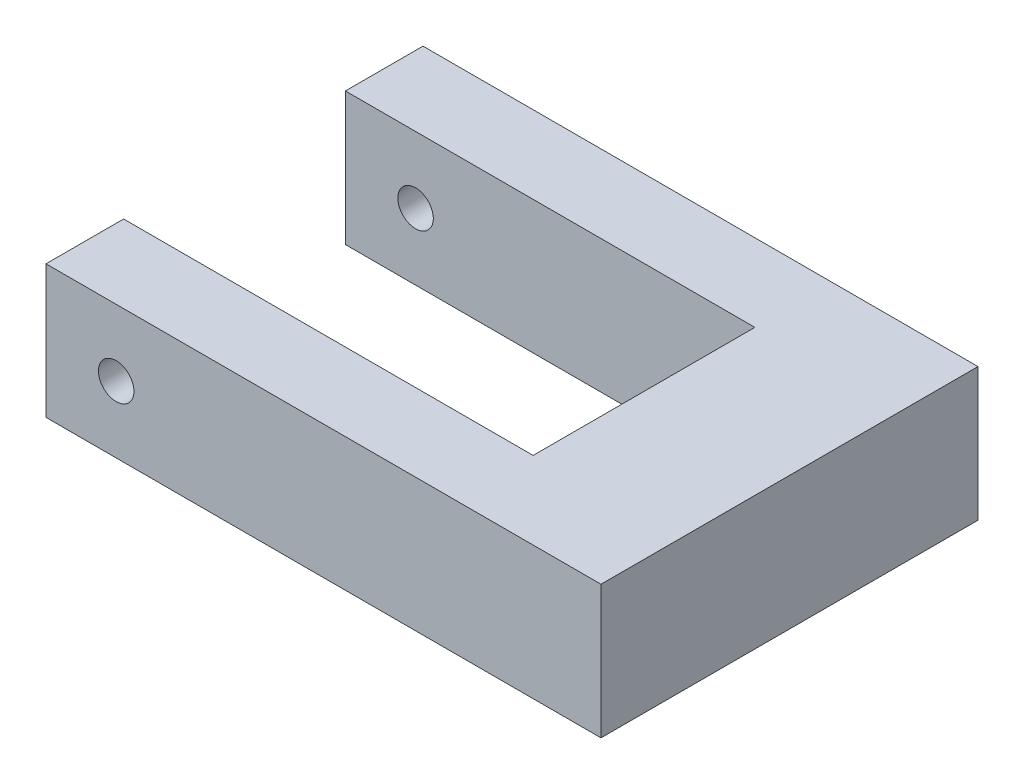
ISO-10303-21;
HEADER;
FILE_DESCRIPTION(('STEP AP214'),'2;1');
FILE_NAME('part.step','',(''),(''),'','','');
FILE_SCHEMA(('AUTOMOTIVE_DESIGN { 1 0 10303 214 1 1 1 1 }'));
ENDSEC;
DATA;
#1=APPLICATION_CONTEXT('core data for automotive mechanical design processes');
#2=APPLICATION_PROTOCOL_DEFINITION('international standard','automotive_design',2000,#1);
#3=PRODUCT_CONTEXT('',#1,'mechanical');
#4=PRODUCT('Part','Part','',(#3));
#5=PRODUCT_RELATED_PRODUCT_CATEGORY('part','',(#4));
#6=PRODUCT_DEFINITION_FORMATION('','',#4);
#7=PRODUCT_DEFINITION_CONTEXT('part definition',#1,'design');
#8=PRODUCT_DEFINITION('design','',#6,#7);
#9=PRODUCT_DEFINITION_SHAPE('','',#8);
#10=(LENGTH_UNIT() NAMED_UNIT(*) SI_UNIT(.MILLI.,.METRE.));
#11=(NAMED_UNIT(*) PLANE_ANGLE_UNIT() SI_UNIT($,.RADIAN.));
#12=(NAMED_UNIT(*) SI_UNIT($,.STERADIAN.) SOLID_ANGLE_UNIT());
#13=UNCERTAINTY_MEASURE_WITH_UNIT(LENGTH_MEASURE(1.E-05),#10,'distance_accuracy_value','');
#14=(GEOMETRIC_REPRESENTATION_CONTEXT(3) GLOBAL_UNCERTAINTY_ASSIGNED_CONTEXT((#13)) GLOBAL_UNIT_ASSIGNED_CONTEXT((#10,
#11,#12)) REPRESENTATION_CONTEXT('',''));
#15=CARTESIAN_POINT('',(0.,0.,0.));
#16=DIRECTION('',(0.,0.,1.));
#17=DIRECTION('',(1.,0.,0.));
#18=AXIS2_PLACEMENT_3D('',#15,#16,#17);
#19=CARTESIAN_POINT('',(0.,5.9580992385565,-77.5));
#20=DIRECTION('',(-1.,0.,0.));
#21=DIRECTION('',(0.,-1.,0.));
#22=AXIS2_PLACEMENT_3D('',#19,#20,#21);
#23=PLANE('',#22);
#24=DIRECTION('',(0.,-1.,0.));
#25=VECTOR('',#24,1.);
#26=CARTESIAN_POINT('',(0.,5.9580992385565,-60.));
#27=LINE('',#26,#25);
#28=CARTESIAN_POINT('',(0.,5.9580992385565,-60.));
#29=VERTEX_POINT('',#28);
#30=CARTESIAN_POINT('',(0.,-24.0419007614435,-60.));
#31=VERTEX_POINT('',#30);
#32=EDGE_CURVE('E42',#29,#31,#27,.T.);
#33=ORIENTED_EDGE('',*,*,#32,.F.);
#34=DIRECTION('',(0.,0.,1.));
#35=VECTOR('',#34,1.);
#36=CARTESIAN_POINT('',(0.,5.9580992385565,-77.5));
#37=LINE('',#36,#35);
#38=CARTESIAN_POINT('',(0.,5.9580992385565,-77.5));
#39=VERTEX_POINT('',#38);
#40=EDGE_CURVE('E85',#39,#29,#37,.T.);
#41=ORIENTED_EDGE('',*,*,#40,.F.);
#42=DIRECTION('',(0.,-1.,0.));
#43=VECTOR('',#42,1.);
#44=CARTESIAN_POINT('',(0.,5.9580992385565,-77.5));
#45=LINE('',#44,#43);
#46=CARTESIAN_POINT('',(0.,-24.0419007614435,-77.5));
#47=VERTEX_POINT('',#46);
#48=EDGE_CURVE('E139',#39,#47,#45,.T.);
#49=ORIENTED_EDGE('',*,*,#48,.T.);
#50=DIRECTION('',(0.,0.,1.));
#51=VECTOR('',#50,1.);
#52=CARTESIAN_POINT('',(0.,-24.0419007614435,-77.5));
#53=LINE('',#52,#51);
#54=EDGE_CURVE('E162',#47,#31,#53,.T.);
#55=ORIENTED_EDGE('',*,*,#54,.T.);
#56=EDGE_LOOP('',(#33,#41,#49,#55));
#57=FACE_BOUND('',#56,.T.);
#58=ADVANCED_FACE('F33',(#57),#23,.T.);
#59=CARTESIAN_POINT('',(0.,5.9580992385565,-77.5));
#60=DIRECTION('',(0.,1.,0.));
#61=DIRECTION('',(-1.,0.,0.));
#62=AXIS2_PLACEMENT_3D('',#59,#60,#61);
#63=PLANE('',#62);
#64=DIRECTION('',(-1.,0.,0.));
#65=VECTOR('',#64,1.);
#66=CARTESIAN_POINT('',(0.,5.9580992385565,-60.));
#67=LINE('',#66,#65);
#68=CARTESIAN_POINT('',(92.3281950153062,5.9580992385565,-60.));
#69=VERTEX_POINT('',#68);
#70=EDGE_CURVE('E132',#69,#29,#67,.T.);
#71=ORIENTED_EDGE('',*,*,#70,.F.);
#72=DIRECTION('',(0.,0.,-1.));
#73=VECTOR('',#72,1.);
#74=CARTESIAN_POINT('',(92.3281950153062,5.9580992385565,-77.5));
#75=LINE('',#74,#73);
#76=CARTESIAN_POINT('',(92.3281950153062,5.9580992385565,-10.));
#77=VERTEX_POINT('',#76);
#78=EDGE_CURVE('E134',#77,#69,#75,.T.);
#79=ORIENTED_EDGE('',*,*,#78,.F.);
#80=DIRECTION('',(1.,0.,0.));
#81=VECTOR('',#80,1.);
#82=CARTESIAN_POINT('',(0.,5.9580992385565,-10.));
#83=LINE('',#82,#81);
#84=CARTESIAN_POINT('',(0.,5.9580992385565,-10.));
#85=VERTEX_POINT('',#84);
#86=EDGE_CURVE('E119',#85,#77,#83,.T.);
#87=ORIENTED_EDGE('',*,*,#86,.F.);
#88=CARTESIAN_POINT('',(0.,5.9580992385565,7.5));
#89=VERTEX_POINT('',#88);
#90=EDGE_CURVE('E147',#85,#89,#37,.T.);
#91=ORIENTED_EDGE('',*,*,#90,.T.);
#92=DIRECTION('',(-1.,0.,0.));
#93=VECTOR('',#92,1.);
#94=CARTESIAN_POINT('',(0.,5.9580992385565,7.5));
#95=LINE('',#94,#93);
#96=CARTESIAN_POINT('',(125.13165801171,5.9580992385565,7.5));
#97=VERTEX_POINT('',#96);
#98=EDGE_CURVE('E136',#97,#89,#95,.T.);
#99=ORIENTED_EDGE('',*,*,#98,.F.);
#100=DIRECTION('',(0.,0.,1.));
#101=VECTOR('',#100,1.);
#102=CARTESIAN_POINT('',(125.13165801171,5.9580992385565,-77.5));
#103=LINE('',#102,#101);
#104=CARTESIAN_POINT('',(125.13165801171,5.9580992385565,-77.5));
#105=VERTEX_POINT('',#104);
#106=EDGE_CURVE('E58',#105,#97,#103,.T.);
#107=ORIENTED_EDGE('',*,*,#106,.F.);
#108=DIRECTION('',(-1.,0.,0.));
#109=VECTOR('',#108,1.);
#110=CARTESIAN_POINT('',(0.,5.9580992385565,-77.5));
#111=LINE('',#110,#109);
#112=EDGE_CURVE('E137',#105,#39,#111,.T.);
#113=ORIENTED_EDGE('',*,*,#112,.T.);
#114=ORIENTED_EDGE('',*,*,#40,.T.);
#115=EDGE_LOOP('',(#71,#79,#87,#91,#99,#107,#113,#114));
#116=FACE_BOUND('',#115,.T.);
#117=ADVANCED_FACE('F35',(#116),#63,.T.);
#118=CARTESIAN_POINT('',(125.13165801171,5.9580992385565,-77.5));
#119=DIRECTION('',(1.,0.,0.));
#120=DIRECTION('',(0.,0.,-1.));
#121=AXIS2_PLACEMENT_3D('',#118,#119,#120);
#122=PLANE('',#121);
#123=DIRECTION('',(0.,1.,0.));
#124=VECTOR('',#123,1.);
#125=CARTESIAN_POINT('',(125.13165801171,5.9580992385565,7.5));
#126=LINE('',#125,#124);
#127=CARTESIAN_POINT('',(125.13165801171,-24.0419007614435,7.5));
#128=VERTEX_POINT('',#127);
#129=EDGE_CURVE('E140',#128,#97,#126,.T.);
#130=ORIENTED_EDGE('',*,*,#129,.F.);
#131=DIRECTION('',(0.,0.,1.));
#132=VECTOR('',#131,1.);
#133=CARTESIAN_POINT('',(125.13165801171,-24.0419007614435,-77.5));
#134=LINE('',#133,#132);
#135=CARTESIAN_POINT('',(125.13165801171,-24.0419007614435,-77.5));
#136=VERTEX_POINT('',#135);
#137=EDGE_CURVE('E160',#136,#128,#134,.T.);
#138=ORIENTED_EDGE('',*,*,#137,.F.);
#139=DIRECTION('',(0.,1.,0.));
#140=VECTOR('',#139,1.);
#141=CARTESIAN_POINT('',(125.13165801171,5.9580992385565,-77.5));
#142=LINE('',#141,#140);
#143=EDGE_CURVE('E145',#136,#105,#142,.T.);
#144=ORIENTED_EDGE('',*,*,#143,.T.);
#145=ORIENTED_EDGE('',*,*,#106,.T.);
#146=EDGE_LOOP('',(#130,#138,#144,#145));
#147=FACE_BOUND('',#146,.T.);
#148=ADVANCED_FACE('F180',(#147),#122,.T.);
#149=CARTESIAN_POINT('',(0.,-24.0419007614435,-77.5));
#150=DIRECTION('',(0.,-1.,0.));
#151=DIRECTION('',(0.,0.,-1.));
#152=AXIS2_PLACEMENT_3D('',#149,#150,#151);
#153=PLANE('',#152);
#154=DIRECTION('',(1.,0.,0.));
#155=VECTOR('',#154,1.);
#156=CARTESIAN_POINT('',(0.,-24.0419007614435,-60.));
#157=LINE('',#156,#155);
#158=CARTESIAN_POINT('',(92.3281950153062,-24.0419007614435,-60.));
#159=VERTEX_POINT('',#158);
#160=EDGE_CURVE('E127',#31,#159,#157,.T.);
#161=ORIENTED_EDGE('',*,*,#160,.F.);
#162=ORIENTED_EDGE('',*,*,#54,.F.);
#163=DIRECTION('',(1.,0.,0.));
#164=VECTOR('',#163,1.);
#165=CARTESIAN_POINT('',(0.,-24.0419007614435,-77.5));
#166=LINE('',#165,#164);
#167=EDGE_CURVE('E142',#47,#136,#166,.T.);
#168=ORIENTED_EDGE('',*,*,#167,.T.);
#169=ORIENTED_EDGE('',*,*,#137,.T.);
#170=DIRECTION('',(1.,0.,0.));
#171=VECTOR('',#170,1.);
#172=CARTESIAN_POINT('',(0.,-24.0419007614435,7.5));
#173=LINE('',#172,#171);
#174=CARTESIAN_POINT('',(0.,-24.0419007614435,7.5));
#175=VERTEX_POINT('',#174);
#176=EDGE_CURVE('E153',#175,#128,#173,.T.);
#177=ORIENTED_EDGE('',*,*,#176,.F.);
#178=CARTESIAN_POINT('',(0.,-24.0419007614435,-10.));
#179=VERTEX_POINT('',#178);
#180=EDGE_CURVE('E125',#179,#175,#53,.T.);
#181=ORIENTED_EDGE('',*,*,#180,.F.);
#182=DIRECTION('',(-1.,0.,0.));
#183=VECTOR('',#182,1.);
#184=CARTESIAN_POINT('',(0.,-24.0419007614435,-10.));
#185=LINE('',#184,#183);
#186=CARTESIAN_POINT('',(92.3281950153062,-24.0419007614435,-10.));
#187=VERTEX_POINT('',#186);
#188=EDGE_CURVE('E49',#187,#179,#185,.T.);
#189=ORIENTED_EDGE('',*,*,#188,.F.);
#190=DIRECTION('',(0.,0.,1.));
#191=VECTOR('',#190,1.);
#192=CARTESIAN_POINT('',(92.3281950153062,-24.0419007614435,-77.5));
#193=LINE('',#192,#191);
#194=EDGE_CURVE('E11',#159,#187,#193,.T.);
#195=ORIENTED_EDGE('',*,*,#194,.F.);
#196=EDGE_LOOP('',(#161,#162,#168,#169,#177,#181,#189,#195));
#197=FACE_BOUND('',#196,.T.);
#198=ADVANCED_FACE('F123',(#197),#153,.T.);
#199=DIRECTION('',(0.,1.,0.));
#200=VECTOR('',#199,1.);
#201=CARTESIAN_POINT('',(0.,5.9580992385565,-10.));
#202=LINE('',#201,#200);
#203=EDGE_CURVE('E159',#179,#85,#202,.T.);
#204=ORIENTED_EDGE('',*,*,#203,.F.);
#205=ORIENTED_EDGE('',*,*,#180,.T.);
#206=DIRECTION('',(0.,-1.,0.));
#207=VECTOR('',#206,1.);
#208=CARTESIAN_POINT('',(0.,5.9580992385565,7.5));
#209=LINE('',#208,#207);
#210=EDGE_CURVE('E150',#89,#175,#209,.T.);
#211=ORIENTED_EDGE('',*,*,#210,.F.);
#212=ORIENTED_EDGE('',*,*,#90,.F.);
#213=EDGE_LOOP('',(#204,#205,#211,#212));
#214=FACE_BOUND('',#213,.T.);
#215=ADVANCED_FACE('F177',(#214),#23,.T.);
#216=CARTESIAN_POINT('',(125.13165801171,5.9580992385565,-77.5));
#217=DIRECTION('',(0.,0.,-1.));
#218=DIRECTION('',(-1.,0.,0.));
#219=AXIS2_PLACEMENT_3D('',#216,#217,#218);
#220=PLANE('',#219);
#221=CARTESIAN_POINT('',(15.8239530552189,-9.0419007614435,-77.5));
#222=DIRECTION('',(0.,0.,-1.));
#223=DIRECTION('',(-1.,0.,0.));
#224=AXIS2_PLACEMENT_3D('',#221,#222,#223);
#225=CIRCLE('',#224,4.);
#226=CARTESIAN_POINT('',(11.8239530552189,-9.0419007614435,-77.5));
#227=VERTEX_POINT('',#226);
#228=EDGE_CURVE('E120',#227,#227,#225,.T.);
#229=ORIENTED_EDGE('',*,*,#228,.F.);
#230=EDGE_LOOP('',(#229));
#231=FACE_BOUND('',#230,.T.);
#232=ORIENTED_EDGE('',*,*,#112,.F.);
#233=ORIENTED_EDGE('',*,*,#143,.F.);
#234=ORIENTED_EDGE('',*,*,#167,.F.);
#235=ORIENTED_EDGE('',*,*,#48,.F.);
#236=EDGE_LOOP('',(#232,#233,#234,#235));
#237=FACE_BOUND('',#236,.T.);
#238=ADVANCED_FACE('F172',(#231,#237),#220,.T.);
#239=CARTESIAN_POINT('',(125.13165801171,5.9580992385565,7.5));
#240=DIRECTION('',(0.,0.,-1.));
#241=DIRECTION('',(-1.,0.,0.));
#242=AXIS2_PLACEMENT_3D('',#239,#240,#241);
#243=PLANE('',#242);
#244=CARTESIAN_POINT('',(15.8239530552189,-9.0419007614435,7.50000000000001));
#245=DIRECTION('',(0.,0.,-1.));
#246=DIRECTION('',(-1.,0.,0.));
#247=AXIS2_PLACEMENT_3D('',#244,#245,#246);
#248=CIRCLE('',#247,4.);
#249=CARTESIAN_POINT('',(11.8239530552189,-9.0419007614435,7.50000000000001));
#250=VERTEX_POINT('',#249);
#251=EDGE_CURVE('E225',#250,#250,#248,.T.);
#252=ORIENTED_EDGE('',*,*,#251,.T.);
#253=EDGE_LOOP('',(#252));
#254=FACE_BOUND('',#253,.T.);
#255=ORIENTED_EDGE('',*,*,#98,.T.);
#256=ORIENTED_EDGE('',*,*,#210,.T.);
#257=ORIENTED_EDGE('',*,*,#176,.T.);
#258=ORIENTED_EDGE('',*,*,#129,.T.);
#259=EDGE_LOOP('',(#255,#256,#257,#258));
#260=FACE_BOUND('',#259,.T.);
#261=ADVANCED_FACE('F179',(#254,#260),#243,.F.);
#262=CARTESIAN_POINT('',(-2.26609945987824,-43.5,-60.));
#263=DIRECTION('',(0.,0.,-1.));
#264=DIRECTION('',(-1.,0.,0.));
#265=AXIS2_PLACEMENT_3D('',#262,#263,#264);
#266=PLANE('',#265);
#267=CARTESIAN_POINT('',(15.8239530552189,-9.0419007614435,-60.));
#268=DIRECTION('',(0.,0.,-1.));
#269=DIRECTION('',(-1.,0.,0.));
#270=AXIS2_PLACEMENT_3D('',#267,#268,#269);
#271=CIRCLE('',#270,4.);
#272=CARTESIAN_POINT('',(11.8239530552189,-9.0419007614435,-60.));
#273=VERTEX_POINT('',#272);
#274=EDGE_CURVE('E226',#273,#273,#271,.T.);
#275=ORIENTED_EDGE('',*,*,#274,.T.);
#276=EDGE_LOOP('',(#275));
#277=FACE_BOUND('',#276,.T.);
#278=ORIENTED_EDGE('',*,*,#70,.T.);
#279=ORIENTED_EDGE('',*,*,#32,.T.);
#280=ORIENTED_EDGE('',*,*,#160,.T.);
#281=DIRECTION('',(0.,1.,0.));
#282=VECTOR('',#281,1.);
#283=CARTESIAN_POINT('',(92.3281950153062,-43.5,-60.));
#284=LINE('',#283,#282);
#285=EDGE_CURVE('E114',#159,#69,#284,.T.);
#286=ORIENTED_EDGE('',*,*,#285,.T.);
#287=EDGE_LOOP('',(#278,#279,#280,#286));
#288=FACE_BOUND('',#287,.T.);
#289=ADVANCED_FACE('F168',(#277,#288),#266,.F.);
#290=CARTESIAN_POINT('',(92.3281950153062,-43.5,-60.));
#291=DIRECTION('',(1.,0.,0.));
#292=DIRECTION('',(0.,0.,-1.));
#293=AXIS2_PLACEMENT_3D('',#290,#291,#292);
#294=PLANE('',#293);
#295=ORIENTED_EDGE('',*,*,#78,.T.);
#296=ORIENTED_EDGE('',*,*,#285,.F.);
#297=ORIENTED_EDGE('',*,*,#194,.T.);
#298=DIRECTION('',(0.,1.,0.));
#299=VECTOR('',#298,1.);
#300=CARTESIAN_POINT('',(92.3281950153062,-43.5,-10.));
#301=LINE('',#300,#299);
#302=EDGE_CURVE('E111',#187,#77,#301,.T.);
#303=ORIENTED_EDGE('',*,*,#302,.T.);
#304=EDGE_LOOP('',(#295,#296,#297,#303));
#305=FACE_BOUND('',#304,.T.);
#306=ADVANCED_FACE('F110',(#305),#294,.F.);
#307=CARTESIAN_POINT('',(92.3281950153062,-43.5,-10.));
#308=DIRECTION('',(0.,0.,1.));
#309=DIRECTION('',(1.,0.,0.));
#310=AXIS2_PLACEMENT_3D('',#307,#308,#309);
#311=PLANE('',#310);
#312=CARTESIAN_POINT('',(15.8239530552189,-9.0419007614435,-10.));
#313=DIRECTION('',(0.,0.,1.));
#314=DIRECTION('',(1.,0.,0.));
#315=AXIS2_PLACEMENT_3D('',#312,#313,#314);
#316=CIRCLE('',#315,4.);
#317=CARTESIAN_POINT('',(19.8239530552189,-9.0419007614435,-10.));
#318=VERTEX_POINT('',#317);
#319=EDGE_CURVE('E37',#318,#318,#316,.T.);
#320=ORIENTED_EDGE('',*,*,#319,.T.);
#321=EDGE_LOOP('',(#320));
#322=FACE_BOUND('',#321,.T.);
#323=ORIENTED_EDGE('',*,*,#86,.T.);
#324=ORIENTED_EDGE('',*,*,#302,.F.);
#325=ORIENTED_EDGE('',*,*,#188,.T.);
#326=ORIENTED_EDGE('',*,*,#203,.T.);
#327=EDGE_LOOP('',(#323,#324,#325,#326));
#328=FACE_BOUND('',#327,.T.);
#329=ADVANCED_FACE('F117',(#322,#328),#311,.F.);
#330=CARTESIAN_POINT('',(15.8239530552189,-9.0419007614435,-100.));
#331=DIRECTION('',(0.,0.,1.));
#332=DIRECTION('',(1.,0.,0.));
#333=AXIS2_PLACEMENT_3D('',#330,#331,#332);
#334=CYLINDRICAL_SURFACE('',#333,4.);
#335=ORIENTED_EDGE('',*,*,#319,.F.);
#336=EDGE_LOOP('',(#335));
#337=FACE_BOUND('',#336,.T.);
#338=ORIENTED_EDGE('',*,*,#251,.F.);
#339=EDGE_LOOP('',(#338));
#340=FACE_BOUND('',#339,.T.);
#341=ADVANCED_FACE('F206',(#337,#340),#334,.F.);
#342=ORIENTED_EDGE('',*,*,#228,.T.);
#343=EDGE_LOOP('',(#342));
#344=FACE_BOUND('',#343,.T.);
#345=ORIENTED_EDGE('',*,*,#274,.F.);
#346=EDGE_LOOP('',(#345));
#347=FACE_BOUND('',#346,.T.);
#348=ADVANCED_FACE('F214',(#344,#347),#334,.F.);
#349=CLOSED_SHELL('',(#58,#117,#148,#198,#215,#238,#261,#289,#306,#329,#341,#348));
#350=MANIFOLD_SOLID_BREP('B2',#349);
#351=ADVANCED_BREP_SHAPE_REPRESENTATION('',(#18,#350),#14);
#352=SHAPE_DEFINITION_REPRESENTATION(#9,#351);
ENDSEC;
END-ISO-10303-21;
